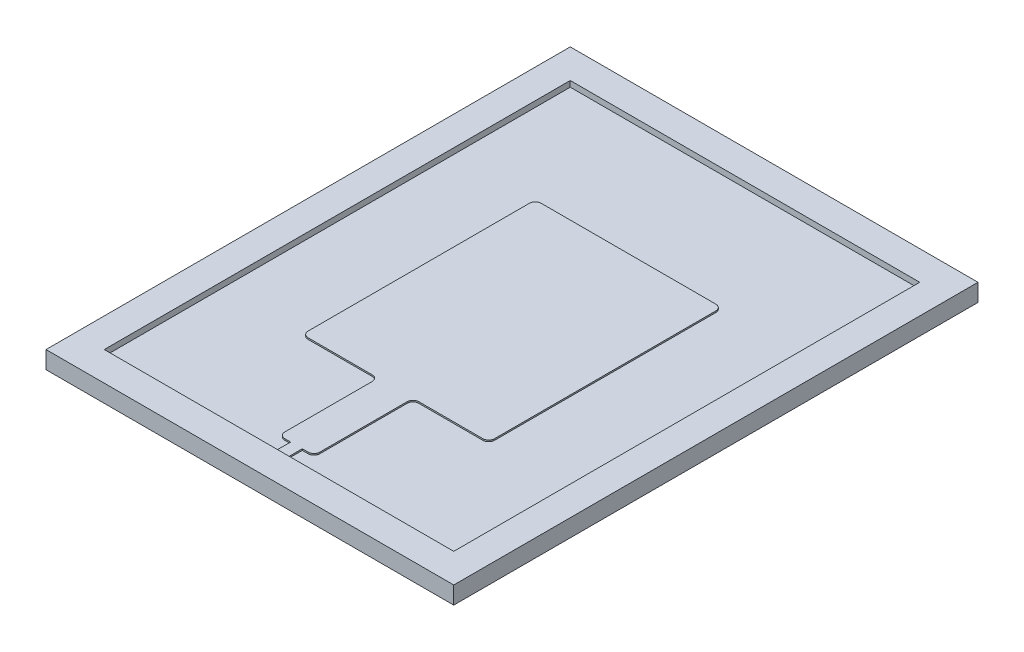
ISO-10303-21;
HEADER;
FILE_DESCRIPTION(('STEP AP214'),'2;1');
FILE_NAME('part.step','',(''),(''),'','','');
FILE_SCHEMA(('AUTOMOTIVE_DESIGN { 1 0 10303 214 1 1 1 1 }'));
ENDSEC;
DATA;
#1=APPLICATION_CONTEXT('core data for automotive mechanical design processes');
#2=APPLICATION_PROTOCOL_DEFINITION('international standard','automotive_design',2000,#1);
#3=PRODUCT_CONTEXT('',#1,'mechanical');
#4=PRODUCT('Part','Part','',(#3));
#5=PRODUCT_RELATED_PRODUCT_CATEGORY('part','',(#4));
#6=PRODUCT_DEFINITION_FORMATION('','',#4);
#7=PRODUCT_DEFINITION_CONTEXT('part definition',#1,'design');
#8=PRODUCT_DEFINITION('design','',#6,#7);
#9=PRODUCT_DEFINITION_SHAPE('','',#8);
#10=(LENGTH_UNIT() NAMED_UNIT(*) SI_UNIT(.MILLI.,.METRE.));
#11=(NAMED_UNIT(*) PLANE_ANGLE_UNIT() SI_UNIT($,.RADIAN.));
#12=(NAMED_UNIT(*) SI_UNIT($,.STERADIAN.) SOLID_ANGLE_UNIT());
#13=UNCERTAINTY_MEASURE_WITH_UNIT(LENGTH_MEASURE(1.E-05),#10,'distance_accuracy_value','');
#14=(GEOMETRIC_REPRESENTATION_CONTEXT(3) GLOBAL_UNCERTAINTY_ASSIGNED_CONTEXT((#13)) GLOBAL_UNIT_ASSIGNED_CONTEXT((#10,
#11,#12)) REPRESENTATION_CONTEXT('',''));
#15=CARTESIAN_POINT('',(0.,0.,0.));
#16=DIRECTION('',(0.,0.,1.));
#17=DIRECTION('',(1.,0.,0.));
#18=AXIS2_PLACEMENT_3D('',#15,#16,#17);
#19=CARTESIAN_POINT('',(-15.,1.,20.));
#20=DIRECTION('',(0.,0.,1.));
#21=DIRECTION('',(1.,0.,0.));
#22=AXIS2_PLACEMENT_3D('',#19,#20,#21);
#23=PLANE('',#22);
#24=DIRECTION('',(0.,-1.,0.));
#25=VECTOR('',#24,1.);
#26=CARTESIAN_POINT('',(-0.499999999999997,1.125,20.));
#27=LINE('',#26,#25);
#28=CARTESIAN_POINT('',(-0.499999999999997,1.125,20.));
#29=VERTEX_POINT('',#28);
#30=CARTESIAN_POINT('',(-0.499999999999997,1.,20.));
#31=VERTEX_POINT('',#30);
#32=EDGE_CURVE('E660',#29,#31,#27,.T.);
#33=ORIENTED_EDGE('',*,*,#32,.T.);
#34=DIRECTION('',(1.,0.,0.));
#35=VECTOR('',#34,1.);
#36=CARTESIAN_POINT('',(-15.,1.,20.));
#37=LINE('',#36,#35);
#38=CARTESIAN_POINT('',(-15.,1.,20.));
#39=VERTEX_POINT('',#38);
#40=EDGE_CURVE('E258',#39,#31,#37,.T.);
#41=ORIENTED_EDGE('',*,*,#40,.F.);
#42=DIRECTION('',(0.,1.,0.));
#43=VECTOR('',#42,1.);
#44=CARTESIAN_POINT('',(-15.,1.,20.));
#45=LINE('',#44,#43);
#46=CARTESIAN_POINT('',(-15.,1.5,20.));
#47=VERTEX_POINT('',#46);
#48=EDGE_CURVE('E277',#39,#47,#45,.T.);
#49=ORIENTED_EDGE('',*,*,#48,.T.);
#50=DIRECTION('',(1.,0.,0.));
#51=VECTOR('',#50,1.);
#52=CARTESIAN_POINT('',(-15.,1.5,20.));
#53=LINE('',#52,#51);
#54=CARTESIAN_POINT('',(15.,1.5,20.));
#55=VERTEX_POINT('',#54);
#56=EDGE_CURVE('E267',#47,#55,#53,.T.);
#57=ORIENTED_EDGE('',*,*,#56,.T.);
#58=DIRECTION('',(0.,1.,0.));
#59=VECTOR('',#58,1.);
#60=CARTESIAN_POINT('',(15.,1.,20.));
#61=LINE('',#60,#59);
#62=CARTESIAN_POINT('',(15.,1.,20.));
#63=VERTEX_POINT('',#62);
#64=EDGE_CURVE('E275',#63,#55,#61,.T.);
#65=ORIENTED_EDGE('',*,*,#64,.F.);
#66=CARTESIAN_POINT('',(0.500000000000002,1.,20.));
#67=VERTEX_POINT('',#66);
#68=EDGE_CURVE('E257',#67,#63,#37,.T.);
#69=ORIENTED_EDGE('',*,*,#68,.F.);
#70=DIRECTION('',(0.,-1.,0.));
#71=VECTOR('',#70,1.);
#72=CARTESIAN_POINT('',(0.500000000000002,1.125,20.));
#73=LINE('',#72,#71);
#74=CARTESIAN_POINT('',(0.500000000000002,1.125,20.));
#75=VERTEX_POINT('',#74);
#76=EDGE_CURVE('E658',#75,#67,#73,.T.);
#77=ORIENTED_EDGE('',*,*,#76,.F.);
#78=DIRECTION('',(1.,0.,0.));
#79=VECTOR('',#78,1.);
#80=CARTESIAN_POINT('',(-0.499999999999997,1.125,20.));
#81=LINE('',#80,#79);
#82=EDGE_CURVE('E742',#29,#75,#81,.T.);
#83=ORIENTED_EDGE('',*,*,#82,.F.);
#84=EDGE_LOOP('',(#33,#41,#49,#57,#65,#69,#77,#83));
#85=FACE_BOUND('',#84,.T.);
#86=ADVANCED_FACE('F33',(#85),#23,.F.);
#87=CARTESIAN_POINT('',(0.,1.,0.));
#88=DIRECTION('',(0.,1.,0.));
#89=DIRECTION('',(0.,0.,1.));
#90=AXIS2_PLACEMENT_3D('',#87,#88,#89);
#91=PLANE('',#90);
#92=ORIENTED_EDGE('',*,*,#40,.T.);
#93=DIRECTION('',(0.,0.,1.));
#94=VECTOR('',#93,1.);
#95=CARTESIAN_POINT('',(-0.499999999999998,1.,18.5));
#96=LINE('',#95,#94);
#97=CARTESIAN_POINT('',(-0.499999999999998,1.,18.5));
#98=VERTEX_POINT('',#97);
#99=EDGE_CURVE('E654',#98,#31,#96,.T.);
#100=ORIENTED_EDGE('',*,*,#99,.F.);
#101=DIRECTION('',(1.,0.,0.));
#102=VECTOR('',#101,1.);
#103=CARTESIAN_POINT('',(-0.999999999999994,1.,18.5));
#104=LINE('',#103,#102);
#105=CARTESIAN_POINT('',(-0.999999999999994,1.,18.5));
#106=VERTEX_POINT('',#105);
#107=EDGE_CURVE('E652',#106,#98,#104,.T.);
#108=ORIENTED_EDGE('',*,*,#107,.F.);
#109=CARTESIAN_POINT('',(-0.999999999999998,1.,18.));
#110=DIRECTION('',(0.,1.,0.));
#111=DIRECTION('',(0.,0.,-1.));
#112=AXIS2_PLACEMENT_3D('',#109,#110,#111);
#113=CIRCLE('',#112,0.5);
#114=CARTESIAN_POINT('',(-1.5,1.,18.));
#115=VERTEX_POINT('',#114);
#116=EDGE_CURVE('E650',#115,#106,#113,.T.);
#117=ORIENTED_EDGE('',*,*,#116,.F.);
#118=DIRECTION('',(0.,0.,1.));
#119=VECTOR('',#118,1.);
#120=CARTESIAN_POINT('',(-1.5,1.,10.5));
#121=LINE('',#120,#119);
#122=CARTESIAN_POINT('',(-1.5,1.,10.5));
#123=VERTEX_POINT('',#122);
#124=EDGE_CURVE('E648',#123,#115,#121,.T.);
#125=ORIENTED_EDGE('',*,*,#124,.F.);
#126=CARTESIAN_POINT('',(-2.,1.,10.5));
#127=DIRECTION('',(0.,-1.,0.));
#128=DIRECTION('',(0.,0.,1.));
#129=AXIS2_PLACEMENT_3D('',#126,#127,#128);
#130=CIRCLE('',#129,0.5);
#131=CARTESIAN_POINT('',(-2.,1.,10.));
#132=VERTEX_POINT('',#131);
#133=EDGE_CURVE('E646',#132,#123,#130,.T.);
#134=ORIENTED_EDGE('',*,*,#133,.F.);
#135=DIRECTION('',(1.,0.,0.));
#136=VECTOR('',#135,1.);
#137=CARTESIAN_POINT('',(-7.5,1.,10.));
#138=LINE('',#137,#136);
#139=CARTESIAN_POINT('',(-7.5,1.,10.));
#140=VERTEX_POINT('',#139);
#141=EDGE_CURVE('E644',#140,#132,#138,.T.);
#142=ORIENTED_EDGE('',*,*,#141,.F.);
#143=CARTESIAN_POINT('',(-7.5,1.,9.5));
#144=DIRECTION('',(0.,1.,0.));
#145=DIRECTION('',(0.,0.,1.));
#146=AXIS2_PLACEMENT_3D('',#143,#144,#145);
#147=CIRCLE('',#146,0.5);
#148=CARTESIAN_POINT('',(-8.,1.,9.5));
#149=VERTEX_POINT('',#148);
#150=EDGE_CURVE('E642',#149,#140,#147,.T.);
#151=ORIENTED_EDGE('',*,*,#150,.F.);
#152=DIRECTION('',(0.,0.,1.));
#153=VECTOR('',#152,1.);
#154=CARTESIAN_POINT('',(-8.,1.,-9.5));
#155=LINE('',#154,#153);
#156=CARTESIAN_POINT('',(-8.,1.,-9.5));
#157=VERTEX_POINT('',#156);
#158=EDGE_CURVE('E640',#157,#149,#155,.T.);
#159=ORIENTED_EDGE('',*,*,#158,.F.);
#160=CARTESIAN_POINT('',(-7.5,1.,-9.5));
#161=DIRECTION('',(0.,1.,0.));
#162=DIRECTION('',(0.,0.,1.));
#163=AXIS2_PLACEMENT_3D('',#160,#161,#162);
#164=CIRCLE('',#163,0.5);
#165=CARTESIAN_POINT('',(-7.5,1.,-10.));
#166=VERTEX_POINT('',#165);
#167=EDGE_CURVE('E638',#166,#157,#164,.T.);
#168=ORIENTED_EDGE('',*,*,#167,.F.);
#169=DIRECTION('',(-1.,0.,0.));
#170=VECTOR('',#169,1.);
#171=CARTESIAN_POINT('',(-7.5,1.,-10.));
#172=LINE('',#171,#170);
#173=CARTESIAN_POINT('',(7.49999999999999,1.,-10.));
#174=VERTEX_POINT('',#173);
#175=EDGE_CURVE('E636',#174,#166,#172,.T.);
#176=ORIENTED_EDGE('',*,*,#175,.F.);
#177=CARTESIAN_POINT('',(7.5,1.,-9.5));
#178=DIRECTION('',(0.,1.,0.));
#179=DIRECTION('',(0.,0.,-1.));
#180=AXIS2_PLACEMENT_3D('',#177,#178,#179);
#181=CIRCLE('',#180,0.5);
#182=CARTESIAN_POINT('',(8.,1.,-9.5));
#183=VERTEX_POINT('',#182);
#184=EDGE_CURVE('E634',#183,#174,#181,.T.);
#185=ORIENTED_EDGE('',*,*,#184,.F.);
#186=DIRECTION('',(0.,0.,-1.));
#187=VECTOR('',#186,1.);
#188=CARTESIAN_POINT('',(8.,1.,-9.5));
#189=LINE('',#188,#187);
#190=CARTESIAN_POINT('',(8.,1.,9.5));
#191=VERTEX_POINT('',#190);
#192=EDGE_CURVE('E632',#191,#183,#189,.T.);
#193=ORIENTED_EDGE('',*,*,#192,.F.);
#194=CARTESIAN_POINT('',(7.5,1.,9.5));
#195=DIRECTION('',(0.,1.,0.));
#196=DIRECTION('',(0.,0.,1.));
#197=AXIS2_PLACEMENT_3D('',#194,#195,#196);
#198=CIRCLE('',#197,0.5);
#199=CARTESIAN_POINT('',(7.49999999999999,1.,10.));
#200=VERTEX_POINT('',#199);
#201=EDGE_CURVE('E630',#200,#191,#198,.T.);
#202=ORIENTED_EDGE('',*,*,#201,.F.);
#203=DIRECTION('',(1.,0.,0.));
#204=VECTOR('',#203,1.);
#205=CARTESIAN_POINT('',(2.,1.,10.));
#206=LINE('',#205,#204);
#207=CARTESIAN_POINT('',(2.,1.,10.));
#208=VERTEX_POINT('',#207);
#209=EDGE_CURVE('E628',#208,#200,#206,.T.);
#210=ORIENTED_EDGE('',*,*,#209,.F.);
#211=CARTESIAN_POINT('',(2.,1.,10.5));
#212=DIRECTION('',(0.,-1.,0.));
#213=DIRECTION('',(0.,0.,-1.));
#214=AXIS2_PLACEMENT_3D('',#211,#212,#213);
#215=CIRCLE('',#214,0.5);
#216=CARTESIAN_POINT('',(1.5,1.,10.5));
#217=VERTEX_POINT('',#216);
#218=EDGE_CURVE('E622',#217,#208,#215,.T.);
#219=ORIENTED_EDGE('',*,*,#218,.F.);
#220=DIRECTION('',(0.,0.,-1.));
#221=VECTOR('',#220,1.);
#222=CARTESIAN_POINT('',(1.5,1.,10.5));
#223=LINE('',#222,#221);
#224=CARTESIAN_POINT('',(1.5,1.,18.));
#225=VERTEX_POINT('',#224);
#226=EDGE_CURVE('E620',#225,#217,#223,.T.);
#227=ORIENTED_EDGE('',*,*,#226,.F.);
#228=CARTESIAN_POINT('',(1.,1.,18.));
#229=DIRECTION('',(0.,1.,0.));
#230=DIRECTION('',(0.,0.,1.));
#231=AXIS2_PLACEMENT_3D('',#228,#229,#230);
#232=CIRCLE('',#231,0.5);
#233=CARTESIAN_POINT('',(0.999999999999998,1.,18.5));
#234=VERTEX_POINT('',#233);
#235=EDGE_CURVE('E241',#234,#225,#232,.T.);
#236=ORIENTED_EDGE('',*,*,#235,.F.);
#237=DIRECTION('',(1.,0.,0.));
#238=VECTOR('',#237,1.);
#239=CARTESIAN_POINT('',(0.500000000000002,1.,18.5));
#240=LINE('',#239,#238);
#241=CARTESIAN_POINT('',(0.500000000000002,1.,18.5));
#242=VERTEX_POINT('',#241);
#243=EDGE_CURVE('E237',#242,#234,#240,.T.);
#244=ORIENTED_EDGE('',*,*,#243,.F.);
#245=DIRECTION('',(0.,0.,-1.));
#246=VECTOR('',#245,1.);
#247=CARTESIAN_POINT('',(0.500000000000002,1.,18.5));
#248=LINE('',#247,#246);
#249=EDGE_CURVE('E616',#67,#242,#248,.T.);
#250=ORIENTED_EDGE('',*,*,#249,.F.);
#251=ORIENTED_EDGE('',*,*,#68,.T.);
#252=DIRECTION('',(0.,0.,-1.));
#253=VECTOR('',#252,1.);
#254=CARTESIAN_POINT('',(15.,1.,20.));
#255=LINE('',#254,#253);
#256=CARTESIAN_POINT('',(15.,1.,-20.));
#257=VERTEX_POINT('',#256);
#258=EDGE_CURVE('E261',#63,#257,#255,.T.);
#259=ORIENTED_EDGE('',*,*,#258,.T.);
#260=DIRECTION('',(-1.,0.,0.));
#261=VECTOR('',#260,1.);
#262=CARTESIAN_POINT('',(15.,1.,-20.));
#263=LINE('',#262,#261);
#264=CARTESIAN_POINT('',(-15.,1.,-20.));
#265=VERTEX_POINT('',#264);
#266=EDGE_CURVE('E250',#257,#265,#263,.T.);
#267=ORIENTED_EDGE('',*,*,#266,.T.);
#268=DIRECTION('',(0.,0.,1.));
#269=VECTOR('',#268,1.);
#270=CARTESIAN_POINT('',(-15.,1.,-20.));
#271=LINE('',#270,#269);
#272=EDGE_CURVE('E253',#265,#39,#271,.T.);
#273=ORIENTED_EDGE('',*,*,#272,.T.);
#274=EDGE_LOOP('',(#92,#100,#108,#117,#125,#134,#142,#151,#159,#168,#176,#185,#193,#202,#210,
#219,#227,#236,#244,#250,#251,#259,#267,#273));
#275=FACE_BOUND('',#274,.T.);
#276=ADVANCED_FACE('F330',(#275),#91,.T.);
#277=CARTESIAN_POINT('',(-17.5,1.5,-22.5));
#278=DIRECTION('',(1.,0.,0.));
#279=DIRECTION('',(0.,0.,-1.));
#280=AXIS2_PLACEMENT_3D('',#277,#278,#279);
#281=PLANE('',#280);
#282=DIRECTION('',(0.,0.,1.));
#283=VECTOR('',#282,1.);
#284=CARTESIAN_POINT('',(-17.5,0.,-22.5));
#285=LINE('',#284,#283);
#286=CARTESIAN_POINT('',(-17.5,0.,-22.5));
#287=VERTEX_POINT('',#286);
#288=CARTESIAN_POINT('',(-17.5,0.,22.5));
#289=VERTEX_POINT('',#288);
#290=EDGE_CURVE('E274',#287,#289,#285,.T.);
#291=ORIENTED_EDGE('',*,*,#290,.T.);
#292=DIRECTION('',(0.,-1.,0.));
#293=VECTOR('',#292,1.);
#294=CARTESIAN_POINT('',(-17.5,1.5,22.5));
#295=LINE('',#294,#293);
#296=CARTESIAN_POINT('',(-17.5,1.5,22.5));
#297=VERTEX_POINT('',#296);
#298=EDGE_CURVE('E11',#297,#289,#295,.T.);
#299=ORIENTED_EDGE('',*,*,#298,.F.);
#300=DIRECTION('',(0.,0.,1.));
#301=VECTOR('',#300,1.);
#302=CARTESIAN_POINT('',(-17.5,1.5,-22.5));
#303=LINE('',#302,#301);
#304=CARTESIAN_POINT('',(-17.5,1.5,-22.5));
#305=VERTEX_POINT('',#304);
#306=EDGE_CURVE('E280',#305,#297,#303,.T.);
#307=ORIENTED_EDGE('',*,*,#306,.F.);
#308=DIRECTION('',(0.,-1.,0.));
#309=VECTOR('',#308,1.);
#310=CARTESIAN_POINT('',(-17.5,1.5,-22.5));
#311=LINE('',#310,#309);
#312=EDGE_CURVE('E290',#305,#287,#311,.T.);
#313=ORIENTED_EDGE('',*,*,#312,.T.);
#314=EDGE_LOOP('',(#291,#299,#307,#313));
#315=FACE_BOUND('',#314,.T.);
#316=ADVANCED_FACE('F35',(#315),#281,.F.);
#317=CARTESIAN_POINT('',(-17.5,1.5,22.5));
#318=DIRECTION('',(0.,0.,-1.));
#319=DIRECTION('',(-1.,0.,0.));
#320=AXIS2_PLACEMENT_3D('',#317,#318,#319);
#321=PLANE('',#320);
#322=DIRECTION('',(1.,0.,0.));
#323=VECTOR('',#322,1.);
#324=CARTESIAN_POINT('',(-17.5,0.,22.5));
#325=LINE('',#324,#323);
#326=CARTESIAN_POINT('',(17.5,0.,22.5));
#327=VERTEX_POINT('',#326);
#328=EDGE_CURVE('E293',#289,#327,#325,.T.);
#329=ORIENTED_EDGE('',*,*,#328,.T.);
#330=DIRECTION('',(0.,-1.,0.));
#331=VECTOR('',#330,1.);
#332=CARTESIAN_POINT('',(17.5,1.5,22.5));
#333=LINE('',#332,#331);
#334=CARTESIAN_POINT('',(17.5,1.5,22.5));
#335=VERTEX_POINT('',#334);
#336=EDGE_CURVE('E41',#335,#327,#333,.T.);
#337=ORIENTED_EDGE('',*,*,#336,.F.);
#338=DIRECTION('',(1.,0.,0.));
#339=VECTOR('',#338,1.);
#340=CARTESIAN_POINT('',(-17.5,1.5,22.5));
#341=LINE('',#340,#339);
#342=EDGE_CURVE('E283',#297,#335,#341,.T.);
#343=ORIENTED_EDGE('',*,*,#342,.F.);
#344=ORIENTED_EDGE('',*,*,#298,.T.);
#345=EDGE_LOOP('',(#329,#337,#343,#344));
#346=FACE_BOUND('',#345,.T.);
#347=ADVANCED_FACE('F323',(#346),#321,.F.);
#348=CARTESIAN_POINT('',(17.5,1.5,-22.5));
#349=DIRECTION('',(-1.,0.,0.));
#350=DIRECTION('',(0.,0.,1.));
#351=AXIS2_PLACEMENT_3D('',#348,#349,#350);
#352=PLANE('',#351);
#353=DIRECTION('',(0.,0.,-1.));
#354=VECTOR('',#353,1.);
#355=CARTESIAN_POINT('',(17.5,0.,-22.5));
#356=LINE('',#355,#354);
#357=CARTESIAN_POINT('',(17.5,0.,-22.5));
#358=VERTEX_POINT('',#357);
#359=EDGE_CURVE('E295',#327,#358,#356,.T.);
#360=ORIENTED_EDGE('',*,*,#359,.T.);
#361=DIRECTION('',(0.,-1.,0.));
#362=VECTOR('',#361,1.);
#363=CARTESIAN_POINT('',(17.5,1.5,-22.5));
#364=LINE('',#363,#362);
#365=CARTESIAN_POINT('',(17.5,1.5,-22.5));
#366=VERTEX_POINT('',#365);
#367=EDGE_CURVE('E300',#366,#358,#364,.T.);
#368=ORIENTED_EDGE('',*,*,#367,.F.);
#369=DIRECTION('',(0.,0.,-1.));
#370=VECTOR('',#369,1.);
#371=CARTESIAN_POINT('',(17.5,1.5,-22.5));
#372=LINE('',#371,#370);
#373=EDGE_CURVE('E286',#335,#366,#372,.T.);
#374=ORIENTED_EDGE('',*,*,#373,.F.);
#375=ORIENTED_EDGE('',*,*,#336,.T.);
#376=EDGE_LOOP('',(#360,#368,#374,#375));
#377=FACE_BOUND('',#376,.T.);
#378=ADVANCED_FACE('F307',(#377),#352,.F.);
#379=CARTESIAN_POINT('',(-17.5,1.5,-22.5));
#380=DIRECTION('',(0.,0.,1.));
#381=DIRECTION('',(1.,0.,0.));
#382=AXIS2_PLACEMENT_3D('',#379,#380,#381);
#383=PLANE('',#382);
#384=DIRECTION('',(-1.,0.,0.));
#385=VECTOR('',#384,1.);
#386=CARTESIAN_POINT('',(-17.5,0.,-22.5));
#387=LINE('',#386,#385);
#388=EDGE_CURVE('E284',#358,#287,#387,.T.);
#389=ORIENTED_EDGE('',*,*,#388,.T.);
#390=ORIENTED_EDGE('',*,*,#312,.F.);
#391=DIRECTION('',(-1.,0.,0.));
#392=VECTOR('',#391,1.);
#393=CARTESIAN_POINT('',(-17.5,1.5,-22.5));
#394=LINE('',#393,#392);
#395=EDGE_CURVE('E288',#366,#305,#394,.T.);
#396=ORIENTED_EDGE('',*,*,#395,.F.);
#397=ORIENTED_EDGE('',*,*,#367,.T.);
#398=EDGE_LOOP('',(#389,#390,#396,#397));
#399=FACE_BOUND('',#398,.T.);
#400=ADVANCED_FACE('F316',(#399),#383,.F.);
#401=CARTESIAN_POINT('',(0.,1.5,0.));
#402=DIRECTION('',(0.,1.,0.));
#403=DIRECTION('',(0.,0.,1.));
#404=AXIS2_PLACEMENT_3D('',#401,#402,#403);
#405=PLANE('',#404);
#406=DIRECTION('',(-1.,0.,0.));
#407=VECTOR('',#406,1.);
#408=CARTESIAN_POINT('',(15.,1.5,-20.));
#409=LINE('',#408,#407);
#410=CARTESIAN_POINT('',(15.,1.5,-20.));
#411=VERTEX_POINT('',#410);
#412=CARTESIAN_POINT('',(-15.,1.5,-20.));
#413=VERTEX_POINT('',#412);
#414=EDGE_CURVE('E56',#411,#413,#409,.T.);
#415=ORIENTED_EDGE('',*,*,#414,.F.);
#416=DIRECTION('',(0.,0.,-1.));
#417=VECTOR('',#416,1.);
#418=CARTESIAN_POINT('',(15.,1.5,20.));
#419=LINE('',#418,#417);
#420=EDGE_CURVE('E254',#55,#411,#419,.T.);
#421=ORIENTED_EDGE('',*,*,#420,.F.);
#422=ORIENTED_EDGE('',*,*,#56,.F.);
#423=DIRECTION('',(0.,0.,1.));
#424=VECTOR('',#423,1.);
#425=CARTESIAN_POINT('',(-15.,1.5,-20.));
#426=LINE('',#425,#424);
#427=EDGE_CURVE('E244',#413,#47,#426,.T.);
#428=ORIENTED_EDGE('',*,*,#427,.F.);
#429=EDGE_LOOP('',(#415,#421,#422,#428));
#430=FACE_BOUND('',#429,.T.);
#431=ORIENTED_EDGE('',*,*,#306,.T.);
#432=ORIENTED_EDGE('',*,*,#342,.T.);
#433=ORIENTED_EDGE('',*,*,#373,.T.);
#434=ORIENTED_EDGE('',*,*,#395,.T.);
#435=EDGE_LOOP('',(#431,#432,#433,#434));
#436=FACE_BOUND('',#435,.T.);
#437=ADVANCED_FACE('F322',(#430,#436),#405,.T.);
#438=CARTESIAN_POINT('',(0.,0.,0.));
#439=DIRECTION('',(0.,1.,0.));
#440=DIRECTION('',(0.,0.,1.));
#441=AXIS2_PLACEMENT_3D('',#438,#439,#440);
#442=PLANE('',#441);
#443=ORIENTED_EDGE('',*,*,#290,.F.);
#444=ORIENTED_EDGE('',*,*,#388,.F.);
#445=ORIENTED_EDGE('',*,*,#359,.F.);
#446=ORIENTED_EDGE('',*,*,#328,.F.);
#447=EDGE_LOOP('',(#443,#444,#445,#446));
#448=FACE_BOUND('',#447,.T.);
#449=ADVANCED_FACE('F313',(#448),#442,.F.);
#450=CARTESIAN_POINT('',(15.,1.,-20.));
#451=DIRECTION('',(0.,0.,-1.));
#452=DIRECTION('',(-1.,0.,0.));
#453=AXIS2_PLACEMENT_3D('',#450,#451,#452);
#454=PLANE('',#453);
#455=ORIENTED_EDGE('',*,*,#414,.T.);
#456=DIRECTION('',(0.,1.,0.));
#457=VECTOR('',#456,1.);
#458=CARTESIAN_POINT('',(-15.,1.,-20.));
#459=LINE('',#458,#457);
#460=EDGE_CURVE('E263',#265,#413,#459,.T.);
#461=ORIENTED_EDGE('',*,*,#460,.F.);
#462=ORIENTED_EDGE('',*,*,#266,.F.);
#463=DIRECTION('',(0.,1.,0.));
#464=VECTOR('',#463,1.);
#465=CARTESIAN_POINT('',(15.,1.,-20.));
#466=LINE('',#465,#464);
#467=EDGE_CURVE('E272',#257,#411,#466,.T.);
#468=ORIENTED_EDGE('',*,*,#467,.T.);
#469=EDGE_LOOP('',(#455,#461,#462,#468));
#470=FACE_BOUND('',#469,.T.);
#471=ADVANCED_FACE('F347',(#470),#454,.F.);
#472=CARTESIAN_POINT('',(15.,1.,20.));
#473=DIRECTION('',(1.,0.,0.));
#474=DIRECTION('',(0.,0.,-1.));
#475=AXIS2_PLACEMENT_3D('',#472,#473,#474);
#476=PLANE('',#475);
#477=ORIENTED_EDGE('',*,*,#420,.T.);
#478=ORIENTED_EDGE('',*,*,#467,.F.);
#479=ORIENTED_EDGE('',*,*,#258,.F.);
#480=ORIENTED_EDGE('',*,*,#64,.T.);
#481=EDGE_LOOP('',(#477,#478,#479,#480));
#482=FACE_BOUND('',#481,.T.);
#483=ADVANCED_FACE('F342',(#482),#476,.F.);
#484=CARTESIAN_POINT('',(-15.,1.,-20.));
#485=DIRECTION('',(-1.,0.,0.));
#486=DIRECTION('',(0.,0.,1.));
#487=AXIS2_PLACEMENT_3D('',#484,#485,#486);
#488=PLANE('',#487);
#489=ORIENTED_EDGE('',*,*,#427,.T.);
#490=ORIENTED_EDGE('',*,*,#48,.F.);
#491=ORIENTED_EDGE('',*,*,#272,.F.);
#492=ORIENTED_EDGE('',*,*,#460,.T.);
#493=EDGE_LOOP('',(#489,#490,#491,#492));
#494=FACE_BOUND('',#493,.T.);
#495=ADVANCED_FACE('F343',(#494),#488,.F.);
#496=CARTESIAN_POINT('',(1.,1.125,18.));
#497=DIRECTION('',(0.,-1.,0.));
#498=DIRECTION('',(0.,0.,-1.));
#499=AXIS2_PLACEMENT_3D('',#496,#497,#498);
#500=CYLINDRICAL_SURFACE('',#499,0.5);
#501=ORIENTED_EDGE('',*,*,#235,.T.);
#502=DIRECTION('',(0.,-1.,0.));
#503=VECTOR('',#502,1.);
#504=CARTESIAN_POINT('',(1.5,1.125,18.));
#505=LINE('',#504,#503);
#506=CARTESIAN_POINT('',(1.5,1.125,18.));
#507=VERTEX_POINT('',#506);
#508=EDGE_CURVE('E222',#507,#225,#505,.T.);
#509=ORIENTED_EDGE('',*,*,#508,.F.);
#510=CARTESIAN_POINT('',(1.,1.125,18.));
#511=DIRECTION('',(0.,1.,0.));
#512=DIRECTION('',(0.,0.,1.));
#513=AXIS2_PLACEMENT_3D('',#510,#511,#512);
#514=CIRCLE('',#513,0.5);
#515=CARTESIAN_POINT('',(0.999999999999998,1.125,18.5));
#516=VERTEX_POINT('',#515);
#517=EDGE_CURVE('E229',#516,#507,#514,.T.);
#518=ORIENTED_EDGE('',*,*,#517,.F.);
#519=DIRECTION('',(0.,-1.,0.));
#520=VECTOR('',#519,1.);
#521=CARTESIAN_POINT('',(0.999999999999998,1.125,18.5));
#522=LINE('',#521,#520);
#523=EDGE_CURVE('E614',#516,#234,#522,.T.);
#524=ORIENTED_EDGE('',*,*,#523,.T.);
#525=EDGE_LOOP('',(#501,#509,#518,#524));
#526=FACE_BOUND('',#525,.T.);
#527=ADVANCED_FACE('F239',(#526),#500,.T.);
#528=CARTESIAN_POINT('',(1.5,1.125,10.5));
#529=DIRECTION('',(-1.,0.,0.));
#530=DIRECTION('',(0.,0.,1.));
#531=AXIS2_PLACEMENT_3D('',#528,#529,#530);
#532=PLANE('',#531);
#533=ORIENTED_EDGE('',*,*,#226,.T.);
#534=DIRECTION('',(0.,-1.,0.));
#535=VECTOR('',#534,1.);
#536=CARTESIAN_POINT('',(1.5,1.125,10.5));
#537=LINE('',#536,#535);
#538=CARTESIAN_POINT('',(1.5,1.125,10.5));
#539=VERTEX_POINT('',#538);
#540=EDGE_CURVE('E225',#539,#217,#537,.T.);
#541=ORIENTED_EDGE('',*,*,#540,.F.);
#542=DIRECTION('',(0.,0.,-1.));
#543=VECTOR('',#542,1.);
#544=CARTESIAN_POINT('',(1.5,1.125,10.5));
#545=LINE('',#544,#543);
#546=EDGE_CURVE('E218',#507,#539,#545,.T.);
#547=ORIENTED_EDGE('',*,*,#546,.F.);
#548=ORIENTED_EDGE('',*,*,#508,.T.);
#549=EDGE_LOOP('',(#533,#541,#547,#548));
#550=FACE_BOUND('',#549,.T.);
#551=ADVANCED_FACE('F220',(#550),#532,.F.);
#552=CARTESIAN_POINT('',(2.,1.125,10.5));
#553=DIRECTION('',(0.,-1.,0.));
#554=DIRECTION('',(0.,0.,-1.));
#555=AXIS2_PLACEMENT_3D('',#552,#553,#554);
#556=CYLINDRICAL_SURFACE('',#555,0.5);
#557=ORIENTED_EDGE('',*,*,#218,.T.);
#558=DIRECTION('',(0.,-1.,0.));
#559=VECTOR('',#558,1.);
#560=CARTESIAN_POINT('',(2.,1.125,10.));
#561=LINE('',#560,#559);
#562=CARTESIAN_POINT('',(2.,1.125,10.));
#563=VERTEX_POINT('',#562);
#564=EDGE_CURVE('E246',#563,#208,#561,.T.);
#565=ORIENTED_EDGE('',*,*,#564,.F.);
#566=CARTESIAN_POINT('',(2.,1.125,10.5));
#567=DIRECTION('',(0.,-1.,0.));
#568=DIRECTION('',(0.,0.,-1.));
#569=AXIS2_PLACEMENT_3D('',#566,#567,#568);
#570=CIRCLE('',#569,0.5);
#571=EDGE_CURVE('E228',#539,#563,#570,.T.);
#572=ORIENTED_EDGE('',*,*,#571,.F.);
#573=ORIENTED_EDGE('',*,*,#540,.T.);
#574=EDGE_LOOP('',(#557,#565,#572,#573));
#575=FACE_BOUND('',#574,.T.);
#576=ADVANCED_FACE('F395',(#575),#556,.F.);
#577=CARTESIAN_POINT('',(2.,1.125,10.));
#578=DIRECTION('',(0.,0.,-1.));
#579=DIRECTION('',(-1.,0.,0.));
#580=AXIS2_PLACEMENT_3D('',#577,#578,#579);
#581=PLANE('',#580);
#582=ORIENTED_EDGE('',*,*,#209,.T.);
#583=DIRECTION('',(0.,-1.,0.));
#584=VECTOR('',#583,1.);
#585=CARTESIAN_POINT('',(7.49999999999999,1.125,10.));
#586=LINE('',#585,#584);
#587=CARTESIAN_POINT('',(7.49999999999999,1.125,10.));
#588=VERTEX_POINT('',#587);
#589=EDGE_CURVE('E698',#588,#200,#586,.T.);
#590=ORIENTED_EDGE('',*,*,#589,.F.);
#591=DIRECTION('',(1.,0.,0.));
#592=VECTOR('',#591,1.);
#593=CARTESIAN_POINT('',(2.,1.125,10.));
#594=LINE('',#593,#592);
#595=EDGE_CURVE('E705',#563,#588,#594,.T.);
#596=ORIENTED_EDGE('',*,*,#595,.F.);
#597=ORIENTED_EDGE('',*,*,#564,.T.);
#598=EDGE_LOOP('',(#582,#590,#596,#597));
#599=FACE_BOUND('',#598,.T.);
#600=ADVANCED_FACE('F402',(#599),#581,.F.);
#601=CARTESIAN_POINT('',(7.5,1.125,9.5));
#602=DIRECTION('',(0.,-1.,0.));
#603=DIRECTION('',(0.,0.,-1.));
#604=AXIS2_PLACEMENT_3D('',#601,#602,#603);
#605=CYLINDRICAL_SURFACE('',#604,0.5);
#606=ORIENTED_EDGE('',*,*,#201,.T.);
#607=DIRECTION('',(0.,-1.,0.));
#608=VECTOR('',#607,1.);
#609=CARTESIAN_POINT('',(8.,1.125,9.5));
#610=LINE('',#609,#608);
#611=CARTESIAN_POINT('',(8.,1.125,9.5));
#612=VERTEX_POINT('',#611);
#613=EDGE_CURVE('E695',#612,#191,#610,.T.);
#614=ORIENTED_EDGE('',*,*,#613,.F.);
#615=CARTESIAN_POINT('',(7.5,1.125,9.5));
#616=DIRECTION('',(0.,1.,0.));
#617=DIRECTION('',(0.,0.,1.));
#618=AXIS2_PLACEMENT_3D('',#615,#616,#617);
#619=CIRCLE('',#618,0.5);
#620=EDGE_CURVE('E716',#588,#612,#619,.T.);
#621=ORIENTED_EDGE('',*,*,#620,.F.);
#622=ORIENTED_EDGE('',*,*,#589,.T.);
#623=EDGE_LOOP('',(#606,#614,#621,#622));
#624=FACE_BOUND('',#623,.T.);
#625=ADVANCED_FACE('F410',(#624),#605,.T.);
#626=CARTESIAN_POINT('',(8.,1.125,-9.5));
#627=DIRECTION('',(-1.,0.,0.));
#628=DIRECTION('',(0.,0.,1.));
#629=AXIS2_PLACEMENT_3D('',#626,#627,#628);
#630=PLANE('',#629);
#631=ORIENTED_EDGE('',*,*,#192,.T.);
#632=DIRECTION('',(0.,-1.,0.));
#633=VECTOR('',#632,1.);
#634=CARTESIAN_POINT('',(8.,1.125,-9.5));
#635=LINE('',#634,#633);
#636=CARTESIAN_POINT('',(8.,1.125,-9.5));
#637=VERTEX_POINT('',#636);
#638=EDGE_CURVE('E692',#637,#183,#635,.T.);
#639=ORIENTED_EDGE('',*,*,#638,.F.);
#640=DIRECTION('',(0.,0.,-1.));
#641=VECTOR('',#640,1.);
#642=CARTESIAN_POINT('',(8.,1.125,-9.5));
#643=LINE('',#642,#641);
#644=EDGE_CURVE('E713',#612,#637,#643,.T.);
#645=ORIENTED_EDGE('',*,*,#644,.F.);
#646=ORIENTED_EDGE('',*,*,#613,.T.);
#647=EDGE_LOOP('',(#631,#639,#645,#646));
#648=FACE_BOUND('',#647,.T.);
#649=ADVANCED_FACE('F418',(#648),#630,.F.);
#650=CARTESIAN_POINT('',(7.5,1.125,-9.5));
#651=DIRECTION('',(0.,-1.,0.));
#652=DIRECTION('',(0.,0.,-1.));
#653=AXIS2_PLACEMENT_3D('',#650,#651,#652);
#654=CYLINDRICAL_SURFACE('',#653,0.5);
#655=ORIENTED_EDGE('',*,*,#184,.T.);
#656=DIRECTION('',(0.,-1.,0.));
#657=VECTOR('',#656,1.);
#658=CARTESIAN_POINT('',(7.49999999999999,1.125,-10.));
#659=LINE('',#658,#657);
#660=CARTESIAN_POINT('',(7.49999999999999,1.125,-10.));
#661=VERTEX_POINT('',#660);
#662=EDGE_CURVE('E689',#661,#174,#659,.T.);
#663=ORIENTED_EDGE('',*,*,#662,.F.);
#664=CARTESIAN_POINT('',(7.5,1.125,-9.5));
#665=DIRECTION('',(0.,1.,0.));
#666=DIRECTION('',(0.,0.,-1.));
#667=AXIS2_PLACEMENT_3D('',#664,#665,#666);
#668=CIRCLE('',#667,0.5);
#669=EDGE_CURVE('E715',#637,#661,#668,.T.);
#670=ORIENTED_EDGE('',*,*,#669,.F.);
#671=ORIENTED_EDGE('',*,*,#638,.T.);
#672=EDGE_LOOP('',(#655,#663,#670,#671));
#673=FACE_BOUND('',#672,.T.);
#674=ADVANCED_FACE('F426',(#673),#654,.T.);
#675=CARTESIAN_POINT('',(-7.5,1.125,-10.));
#676=DIRECTION('',(0.,0.,1.));
#677=DIRECTION('',(1.,0.,0.));
#678=AXIS2_PLACEMENT_3D('',#675,#676,#677);
#679=PLANE('',#678);
#680=ORIENTED_EDGE('',*,*,#175,.T.);
#681=DIRECTION('',(0.,-1.,0.));
#682=VECTOR('',#681,1.);
#683=CARTESIAN_POINT('',(-7.5,1.125,-10.));
#684=LINE('',#683,#682);
#685=CARTESIAN_POINT('',(-7.5,1.125,-10.));
#686=VERTEX_POINT('',#685);
#687=EDGE_CURVE('E686',#686,#166,#684,.T.);
#688=ORIENTED_EDGE('',*,*,#687,.F.);
#689=DIRECTION('',(-1.,0.,0.));
#690=VECTOR('',#689,1.);
#691=CARTESIAN_POINT('',(-7.5,1.125,-10.));
#692=LINE('',#691,#690);
#693=EDGE_CURVE('E718',#661,#686,#692,.T.);
#694=ORIENTED_EDGE('',*,*,#693,.F.);
#695=ORIENTED_EDGE('',*,*,#662,.T.);
#696=EDGE_LOOP('',(#680,#688,#694,#695));
#697=FACE_BOUND('',#696,.T.);
#698=ADVANCED_FACE('F434',(#697),#679,.F.);
#699=CARTESIAN_POINT('',(-7.5,1.125,-9.5));
#700=DIRECTION('',(0.,-1.,0.));
#701=DIRECTION('',(0.,0.,-1.));
#702=AXIS2_PLACEMENT_3D('',#699,#700,#701);
#703=CYLINDRICAL_SURFACE('',#702,0.5);
#704=ORIENTED_EDGE('',*,*,#167,.T.);
#705=DIRECTION('',(0.,-1.,0.));
#706=VECTOR('',#705,1.);
#707=CARTESIAN_POINT('',(-8.,1.125,-9.5));
#708=LINE('',#707,#706);
#709=CARTESIAN_POINT('',(-8.,1.125,-9.5));
#710=VERTEX_POINT('',#709);
#711=EDGE_CURVE('E683',#710,#157,#708,.T.);
#712=ORIENTED_EDGE('',*,*,#711,.F.);
#713=CARTESIAN_POINT('',(-7.5,1.125,-9.5));
#714=DIRECTION('',(0.,1.,0.));
#715=DIRECTION('',(0.,0.,1.));
#716=AXIS2_PLACEMENT_3D('',#713,#714,#715);
#717=CIRCLE('',#716,0.5);
#718=EDGE_CURVE('E724',#686,#710,#717,.T.);
#719=ORIENTED_EDGE('',*,*,#718,.F.);
#720=ORIENTED_EDGE('',*,*,#687,.T.);
#721=EDGE_LOOP('',(#704,#712,#719,#720));
#722=FACE_BOUND('',#721,.T.);
#723=ADVANCED_FACE('F442',(#722),#703,.T.);
#724=CARTESIAN_POINT('',(-8.,1.125,-9.5));
#725=DIRECTION('',(1.,0.,0.));
#726=DIRECTION('',(0.,0.,-1.));
#727=AXIS2_PLACEMENT_3D('',#724,#725,#726);
#728=PLANE('',#727);
#729=ORIENTED_EDGE('',*,*,#158,.T.);
#730=DIRECTION('',(0.,-1.,0.));
#731=VECTOR('',#730,1.);
#732=CARTESIAN_POINT('',(-8.,1.125,9.5));
#733=LINE('',#732,#731);
#734=CARTESIAN_POINT('',(-8.,1.125,9.5));
#735=VERTEX_POINT('',#734);
#736=EDGE_CURVE('E680',#735,#149,#733,.T.);
#737=ORIENTED_EDGE('',*,*,#736,.F.);
#738=DIRECTION('',(0.,0.,1.));
#739=VECTOR('',#738,1.);
#740=CARTESIAN_POINT('',(-8.,1.125,-9.5));
#741=LINE('',#740,#739);
#742=EDGE_CURVE('E726',#710,#735,#741,.T.);
#743=ORIENTED_EDGE('',*,*,#742,.F.);
#744=ORIENTED_EDGE('',*,*,#711,.T.);
#745=EDGE_LOOP('',(#729,#737,#743,#744));
#746=FACE_BOUND('',#745,.T.);
#747=ADVANCED_FACE('F450',(#746),#728,.F.);
#748=CARTESIAN_POINT('',(-7.5,1.125,9.5));
#749=DIRECTION('',(0.,-1.,0.));
#750=DIRECTION('',(0.,0.,-1.));
#751=AXIS2_PLACEMENT_3D('',#748,#749,#750);
#752=CYLINDRICAL_SURFACE('',#751,0.5);
#753=ORIENTED_EDGE('',*,*,#150,.T.);
#754=DIRECTION('',(0.,-1.,0.));
#755=VECTOR('',#754,1.);
#756=CARTESIAN_POINT('',(-7.5,1.125,10.));
#757=LINE('',#756,#755);
#758=CARTESIAN_POINT('',(-7.5,1.125,10.));
#759=VERTEX_POINT('',#758);
#760=EDGE_CURVE('E677',#759,#140,#757,.T.);
#761=ORIENTED_EDGE('',*,*,#760,.F.);
#762=CARTESIAN_POINT('',(-7.5,1.125,9.5));
#763=DIRECTION('',(0.,1.,0.));
#764=DIRECTION('',(0.,0.,1.));
#765=AXIS2_PLACEMENT_3D('',#762,#763,#764);
#766=CIRCLE('',#765,0.5);
#767=EDGE_CURVE('E728',#735,#759,#766,.T.);
#768=ORIENTED_EDGE('',*,*,#767,.F.);
#769=ORIENTED_EDGE('',*,*,#736,.T.);
#770=EDGE_LOOP('',(#753,#761,#768,#769));
#771=FACE_BOUND('',#770,.T.);
#772=ADVANCED_FACE('F458',(#771),#752,.T.);
#773=CARTESIAN_POINT('',(-7.5,1.125,10.));
#774=DIRECTION('',(0.,0.,-1.));
#775=DIRECTION('',(-1.,0.,0.));
#776=AXIS2_PLACEMENT_3D('',#773,#774,#775);
#777=PLANE('',#776);
#778=ORIENTED_EDGE('',*,*,#141,.T.);
#779=DIRECTION('',(0.,-1.,0.));
#780=VECTOR('',#779,1.);
#781=CARTESIAN_POINT('',(-2.,1.125,10.));
#782=LINE('',#781,#780);
#783=CARTESIAN_POINT('',(-2.,1.125,10.));
#784=VERTEX_POINT('',#783);
#785=EDGE_CURVE('E674',#784,#132,#782,.T.);
#786=ORIENTED_EDGE('',*,*,#785,.F.);
#787=DIRECTION('',(1.,0.,0.));
#788=VECTOR('',#787,1.);
#789=CARTESIAN_POINT('',(-7.5,1.125,10.));
#790=LINE('',#789,#788);
#791=EDGE_CURVE('E730',#759,#784,#790,.T.);
#792=ORIENTED_EDGE('',*,*,#791,.F.);
#793=ORIENTED_EDGE('',*,*,#760,.T.);
#794=EDGE_LOOP('',(#778,#786,#792,#793));
#795=FACE_BOUND('',#794,.T.);
#796=ADVANCED_FACE('F466',(#795),#777,.F.);
#797=CARTESIAN_POINT('',(-2.,1.125,10.5));
#798=DIRECTION('',(0.,-1.,0.));
#799=DIRECTION('',(0.,0.,-1.));
#800=AXIS2_PLACEMENT_3D('',#797,#798,#799);
#801=CYLINDRICAL_SURFACE('',#800,0.5);
#802=ORIENTED_EDGE('',*,*,#133,.T.);
#803=DIRECTION('',(0.,-1.,0.));
#804=VECTOR('',#803,1.);
#805=CARTESIAN_POINT('',(-1.5,1.125,10.5));
#806=LINE('',#805,#804);
#807=CARTESIAN_POINT('',(-1.5,1.125,10.5));
#808=VERTEX_POINT('',#807);
#809=EDGE_CURVE('E671',#808,#123,#806,.T.);
#810=ORIENTED_EDGE('',*,*,#809,.F.);
#811=CARTESIAN_POINT('',(-2.,1.125,10.5));
#812=DIRECTION('',(0.,-1.,0.));
#813=DIRECTION('',(0.,0.,1.));
#814=AXIS2_PLACEMENT_3D('',#811,#812,#813);
#815=CIRCLE('',#814,0.5);
#816=EDGE_CURVE('E732',#784,#808,#815,.T.);
#817=ORIENTED_EDGE('',*,*,#816,.F.);
#818=ORIENTED_EDGE('',*,*,#785,.T.);
#819=EDGE_LOOP('',(#802,#810,#817,#818));
#820=FACE_BOUND('',#819,.T.);
#821=ADVANCED_FACE('F474',(#820),#801,.F.);
#822=CARTESIAN_POINT('',(-1.5,1.125,10.5));
#823=DIRECTION('',(1.,0.,0.));
#824=DIRECTION('',(0.,0.,-1.));
#825=AXIS2_PLACEMENT_3D('',#822,#823,#824);
#826=PLANE('',#825);
#827=ORIENTED_EDGE('',*,*,#124,.T.);
#828=DIRECTION('',(0.,-1.,0.));
#829=VECTOR('',#828,1.);
#830=CARTESIAN_POINT('',(-1.5,1.125,18.));
#831=LINE('',#830,#829);
#832=CARTESIAN_POINT('',(-1.5,1.125,18.));
#833=VERTEX_POINT('',#832);
#834=EDGE_CURVE('E668',#833,#115,#831,.T.);
#835=ORIENTED_EDGE('',*,*,#834,.F.);
#836=DIRECTION('',(0.,0.,1.));
#837=VECTOR('',#836,1.);
#838=CARTESIAN_POINT('',(-1.5,1.125,10.5));
#839=LINE('',#838,#837);
#840=EDGE_CURVE('E734',#808,#833,#839,.T.);
#841=ORIENTED_EDGE('',*,*,#840,.F.);
#842=ORIENTED_EDGE('',*,*,#809,.T.);
#843=EDGE_LOOP('',(#827,#835,#841,#842));
#844=FACE_BOUND('',#843,.T.);
#845=ADVANCED_FACE('F482',(#844),#826,.F.);
#846=CARTESIAN_POINT('',(-0.999999999999998,1.125,18.));
#847=DIRECTION('',(0.,-1.,0.));
#848=DIRECTION('',(0.,0.,-1.));
#849=AXIS2_PLACEMENT_3D('',#846,#847,#848);
#850=CYLINDRICAL_SURFACE('',#849,0.5);
#851=ORIENTED_EDGE('',*,*,#116,.T.);
#852=DIRECTION('',(0.,-1.,0.));
#853=VECTOR('',#852,1.);
#854=CARTESIAN_POINT('',(-0.999999999999994,1.125,18.5));
#855=LINE('',#854,#853);
#856=CARTESIAN_POINT('',(-0.999999999999994,1.125,18.5));
#857=VERTEX_POINT('',#856);
#858=EDGE_CURVE('E665',#857,#106,#855,.T.);
#859=ORIENTED_EDGE('',*,*,#858,.F.);
#860=CARTESIAN_POINT('',(-0.999999999999998,1.125,18.));
#861=DIRECTION('',(0.,1.,0.));
#862=DIRECTION('',(0.,0.,-1.));
#863=AXIS2_PLACEMENT_3D('',#860,#861,#862);
#864=CIRCLE('',#863,0.5);
#865=EDGE_CURVE('E736',#833,#857,#864,.T.);
#866=ORIENTED_EDGE('',*,*,#865,.F.);
#867=ORIENTED_EDGE('',*,*,#834,.T.);
#868=EDGE_LOOP('',(#851,#859,#866,#867));
#869=FACE_BOUND('',#868,.T.);
#870=ADVANCED_FACE('F490',(#869),#850,.T.);
#871=CARTESIAN_POINT('',(-0.999999999999994,1.125,18.5));
#872=DIRECTION('',(0.,0.,-1.));
#873=DIRECTION('',(-1.,0.,0.));
#874=AXIS2_PLACEMENT_3D('',#871,#872,#873);
#875=PLANE('',#874);
#876=ORIENTED_EDGE('',*,*,#107,.T.);
#877=DIRECTION('',(0.,-1.,0.));
#878=VECTOR('',#877,1.);
#879=CARTESIAN_POINT('',(-0.499999999999998,1.125,18.5));
#880=LINE('',#879,#878);
#881=CARTESIAN_POINT('',(-0.499999999999998,1.125,18.5));
#882=VERTEX_POINT('',#881);
#883=EDGE_CURVE('E662',#882,#98,#880,.T.);
#884=ORIENTED_EDGE('',*,*,#883,.F.);
#885=DIRECTION('',(1.,0.,0.));
#886=VECTOR('',#885,1.);
#887=CARTESIAN_POINT('',(-0.999999999999994,1.125,18.5));
#888=LINE('',#887,#886);
#889=EDGE_CURVE('E738',#857,#882,#888,.T.);
#890=ORIENTED_EDGE('',*,*,#889,.F.);
#891=ORIENTED_EDGE('',*,*,#858,.T.);
#892=EDGE_LOOP('',(#876,#884,#890,#891));
#893=FACE_BOUND('',#892,.T.);
#894=ADVANCED_FACE('F498',(#893),#875,.F.);
#895=CARTESIAN_POINT('',(-0.499999999999998,1.125,18.5));
#896=DIRECTION('',(1.,0.,0.));
#897=DIRECTION('',(0.,0.,-1.));
#898=AXIS2_PLACEMENT_3D('',#895,#896,#897);
#899=PLANE('',#898);
#900=ORIENTED_EDGE('',*,*,#99,.T.);
#901=ORIENTED_EDGE('',*,*,#32,.F.);
#902=DIRECTION('',(0.,0.,1.));
#903=VECTOR('',#902,1.);
#904=CARTESIAN_POINT('',(-0.499999999999998,1.125,18.5));
#905=LINE('',#904,#903);
#906=EDGE_CURVE('E740',#882,#29,#905,.T.);
#907=ORIENTED_EDGE('',*,*,#906,.F.);
#908=ORIENTED_EDGE('',*,*,#883,.T.);
#909=EDGE_LOOP('',(#900,#901,#907,#908));
#910=FACE_BOUND('',#909,.T.);
#911=ADVANCED_FACE('F506',(#910),#899,.F.);
#912=CARTESIAN_POINT('',(0.500000000000002,1.125,18.5));
#913=DIRECTION('',(-1.,0.,0.));
#914=DIRECTION('',(0.,0.,1.));
#915=AXIS2_PLACEMENT_3D('',#912,#913,#914);
#916=PLANE('',#915);
#917=ORIENTED_EDGE('',*,*,#249,.T.);
#918=DIRECTION('',(0.,-1.,0.));
#919=VECTOR('',#918,1.);
#920=CARTESIAN_POINT('',(0.500000000000002,1.125,18.5));
#921=LINE('',#920,#919);
#922=CARTESIAN_POINT('',(0.500000000000002,1.125,18.5));
#923=VERTEX_POINT('',#922);
#924=EDGE_CURVE('E48',#923,#242,#921,.T.);
#925=ORIENTED_EDGE('',*,*,#924,.F.);
#926=DIRECTION('',(0.,0.,-1.));
#927=VECTOR('',#926,1.);
#928=CARTESIAN_POINT('',(0.500000000000002,1.125,18.5));
#929=LINE('',#928,#927);
#930=EDGE_CURVE('E743',#75,#923,#929,.T.);
#931=ORIENTED_EDGE('',*,*,#930,.F.);
#932=ORIENTED_EDGE('',*,*,#76,.T.);
#933=EDGE_LOOP('',(#917,#925,#931,#932));
#934=FACE_BOUND('',#933,.T.);
#935=ADVANCED_FACE('F514',(#934),#916,.F.);
#936=CARTESIAN_POINT('',(0.500000000000002,1.125,18.5));
#937=DIRECTION('',(0.,0.,-1.));
#938=DIRECTION('',(-1.,0.,0.));
#939=AXIS2_PLACEMENT_3D('',#936,#937,#938);
#940=PLANE('',#939);
#941=ORIENTED_EDGE('',*,*,#243,.T.);
#942=ORIENTED_EDGE('',*,*,#523,.F.);
#943=DIRECTION('',(1.,0.,0.));
#944=VECTOR('',#943,1.);
#945=CARTESIAN_POINT('',(0.500000000000002,1.125,18.5));
#946=LINE('',#945,#944);
#947=EDGE_CURVE('E233',#923,#516,#946,.T.);
#948=ORIENTED_EDGE('',*,*,#947,.F.);
#949=ORIENTED_EDGE('',*,*,#924,.T.);
#950=EDGE_LOOP('',(#941,#942,#948,#949));
#951=FACE_BOUND('',#950,.T.);
#952=ADVANCED_FACE('F522',(#951),#940,.F.);
#953=CARTESIAN_POINT('',(1.,1.125,18.));
#954=DIRECTION('',(0.,1.,0.));
#955=DIRECTION('',(0.,0.,1.));
#956=AXIS2_PLACEMENT_3D('',#953,#954,#955);
#957=PLANE('',#956);
#958=ORIENTED_EDGE('',*,*,#517,.T.);
#959=ORIENTED_EDGE('',*,*,#546,.T.);
#960=ORIENTED_EDGE('',*,*,#571,.T.);
#961=ORIENTED_EDGE('',*,*,#595,.T.);
#962=ORIENTED_EDGE('',*,*,#620,.T.);
#963=ORIENTED_EDGE('',*,*,#644,.T.);
#964=ORIENTED_EDGE('',*,*,#669,.T.);
#965=ORIENTED_EDGE('',*,*,#693,.T.);
#966=ORIENTED_EDGE('',*,*,#718,.T.);
#967=ORIENTED_EDGE('',*,*,#742,.T.);
#968=ORIENTED_EDGE('',*,*,#767,.T.);
#969=ORIENTED_EDGE('',*,*,#791,.T.);
#970=ORIENTED_EDGE('',*,*,#816,.T.);
#971=ORIENTED_EDGE('',*,*,#840,.T.);
#972=ORIENTED_EDGE('',*,*,#865,.T.);
#973=ORIENTED_EDGE('',*,*,#889,.T.);
#974=ORIENTED_EDGE('',*,*,#906,.T.);
#975=ORIENTED_EDGE('',*,*,#82,.T.);
#976=ORIENTED_EDGE('',*,*,#930,.T.);
#977=ORIENTED_EDGE('',*,*,#947,.T.);
#978=EDGE_LOOP('',(#958,#959,#960,#961,#962,#963,#964,#965,#966,#967,#968,#969,#970,#971,#972,
#973,#974,#975,#976,#977));
#979=FACE_BOUND('',#978,.T.);
#980=ADVANCED_FACE('F232',(#979),#957,.T.);
#981=CLOSED_SHELL('',(#86,#276,#316,#347,#378,#400,#437,#449,#471,#483,#495,#527,#551,#576,#600,
#625,#649,#674,#698,#723,#747,#772,#796,#821,#845,#870,#894,#911,#935,#952,#980));
#982=MANIFOLD_SOLID_BREP('B2',#981);
#983=ADVANCED_BREP_SHAPE_REPRESENTATION('',(#18,#982),#14);
#984=SHAPE_DEFINITION_REPRESENTATION(#9,#983);
ENDSEC;
END-ISO-10303-21;
